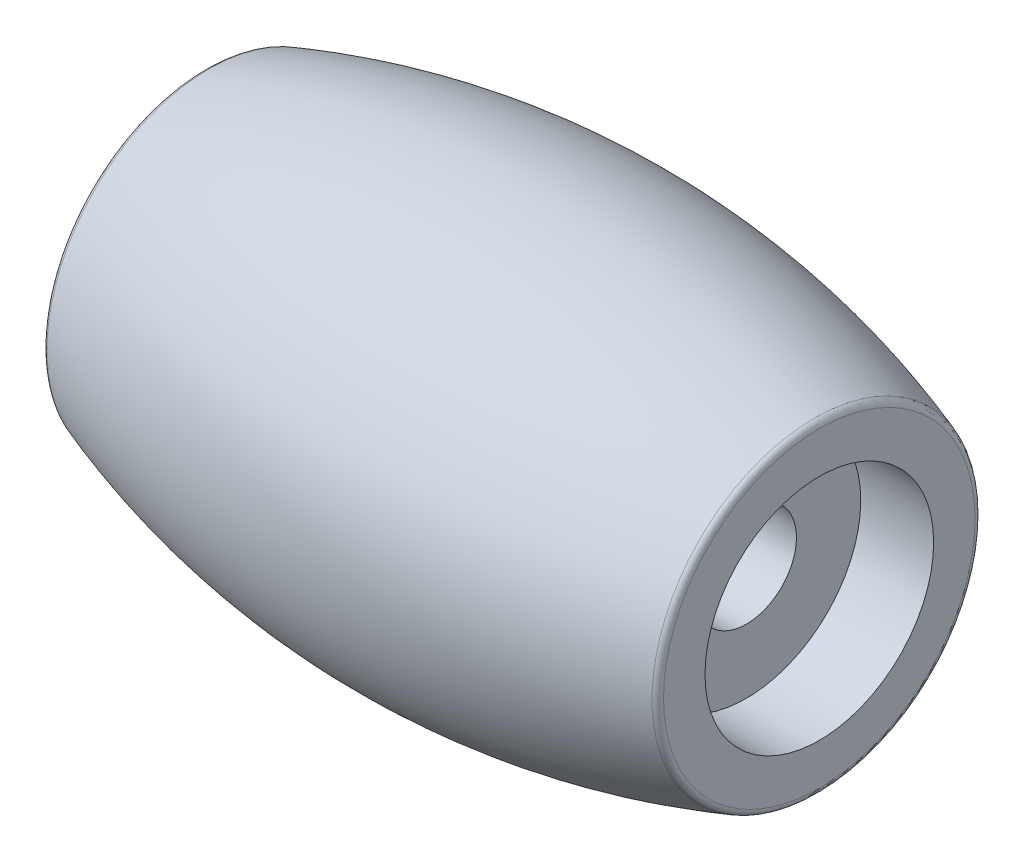
ISO-10303-21;
HEADER;
FILE_DESCRIPTION(('STEP AP214'),'2;1');
FILE_NAME('part.step','',(''),(''),'','','');
FILE_SCHEMA(('AUTOMOTIVE_DESIGN { 1 0 10303 214 1 1 1 1 }'));
ENDSEC;
DATA;
#1=APPLICATION_CONTEXT('core data for automotive mechanical design processes');
#2=APPLICATION_PROTOCOL_DEFINITION('international standard','automotive_design',2000,#1);
#3=PRODUCT_CONTEXT('',#1,'mechanical');
#4=PRODUCT('Part','Part','',(#3));
#5=PRODUCT_RELATED_PRODUCT_CATEGORY('part','',(#4));
#6=PRODUCT_DEFINITION_FORMATION('','',#4);
#7=PRODUCT_DEFINITION_CONTEXT('part definition',#1,'design');
#8=PRODUCT_DEFINITION('design','',#6,#7);
#9=PRODUCT_DEFINITION_SHAPE('','',#8);
#10=(LENGTH_UNIT() NAMED_UNIT(*) SI_UNIT(.MILLI.,.METRE.));
#11=(NAMED_UNIT(*) PLANE_ANGLE_UNIT() SI_UNIT($,.RADIAN.));
#12=(NAMED_UNIT(*) SI_UNIT($,.STERADIAN.) SOLID_ANGLE_UNIT());
#13=UNCERTAINTY_MEASURE_WITH_UNIT(LENGTH_MEASURE(1.E-05),#10,'distance_accuracy_value','');
#14=(GEOMETRIC_REPRESENTATION_CONTEXT(3) GLOBAL_UNCERTAINTY_ASSIGNED_CONTEXT((#13)) GLOBAL_UNIT_ASSIGNED_CONTEXT((#10,
#11,#12)) REPRESENTATION_CONTEXT('',''));
#15=CARTESIAN_POINT('',(0.,0.,0.));
#16=DIRECTION('',(0.,0.,1.));
#17=DIRECTION('',(1.,0.,0.));
#18=AXIS2_PLACEMENT_3D('',#15,#16,#17);
#19=CARTESIAN_POINT('',(-21.5,48.5,0.));
#20=DIRECTION('',(-1.,0.,0.));
#21=DIRECTION('',(0.,0.,1.));
#22=AXIS2_PLACEMENT_3D('',#19,#20,#21);
#23=CYLINDRICAL_SURFACE('',#22,3.5);
#24=CARTESIAN_POINT('',(16.4,48.5,0.));
#25=DIRECTION('',(-1.,0.,0.));
#26=DIRECTION('',(0.,0.,1.));
#27=AXIS2_PLACEMENT_3D('',#24,#25,#26);
#28=CIRCLE('',#27,3.5);
#29=CARTESIAN_POINT('',(16.4,48.5,3.5));
#30=VERTEX_POINT('',#29);
#31=EDGE_CURVE('E255',#30,#30,#28,.F.);
#32=ORIENTED_EDGE('',*,*,#31,.T.);
#33=EDGE_LOOP('',(#32));
#34=FACE_BOUND('',#33,.T.);
#35=CARTESIAN_POINT('',(-16.4,48.5,0.));
#36=DIRECTION('',(-1.,0.,0.));
#37=DIRECTION('',(0.,0.,1.));
#38=AXIS2_PLACEMENT_3D('',#35,#36,#37);
#39=CIRCLE('',#38,3.5);
#40=CARTESIAN_POINT('',(-16.4,48.5,3.5));
#41=VERTEX_POINT('',#40);
#42=EDGE_CURVE('E258',#41,#41,#39,.T.);
#43=ORIENTED_EDGE('',*,*,#42,.T.);
#44=EDGE_LOOP('',(#43));
#45=FACE_BOUND('',#44,.T.);
#46=ADVANCED_FACE('F16',(#34,#45),#23,.F.);
#47=CARTESIAN_POINT('',(16.4,56.5,0.));
#48=DIRECTION('',(-1.,0.,0.));
#49=DIRECTION('',(0.,0.,1.));
#50=AXIS2_PLACEMENT_3D('',#47,#48,#49);
#51=PLANE('',#50);
#52=ORIENTED_EDGE('',*,*,#31,.F.);
#53=EDGE_LOOP('',(#52));
#54=FACE_BOUND('',#53,.T.);
#55=CARTESIAN_POINT('',(16.4,48.5,0.));
#56=DIRECTION('',(-1.,0.,0.));
#57=DIRECTION('',(0.,0.,1.));
#58=AXIS2_PLACEMENT_3D('',#55,#56,#57);
#59=CIRCLE('',#58,8.);
#60=CARTESIAN_POINT('',(16.4,48.5,8.));
#61=VERTEX_POINT('',#60);
#62=EDGE_CURVE('E259',#61,#61,#59,.F.);
#63=ORIENTED_EDGE('',*,*,#62,.T.);
#64=EDGE_LOOP('',(#63));
#65=FACE_BOUND('',#64,.T.);
#66=ADVANCED_FACE('F223',(#54,#65),#51,.F.);
#67=CARTESIAN_POINT('',(-16.4,56.5,0.));
#68=DIRECTION('',(1.,0.,0.));
#69=DIRECTION('',(0.,0.,-1.));
#70=AXIS2_PLACEMENT_3D('',#67,#68,#69);
#71=PLANE('',#70);
#72=ORIENTED_EDGE('',*,*,#42,.F.);
#73=EDGE_LOOP('',(#72));
#74=FACE_BOUND('',#73,.T.);
#75=CARTESIAN_POINT('',(-16.4,48.5,0.));
#76=DIRECTION('',(-1.,0.,0.));
#77=DIRECTION('',(0.,0.,1.));
#78=AXIS2_PLACEMENT_3D('',#75,#76,#77);
#79=CIRCLE('',#78,8.);
#80=CARTESIAN_POINT('',(-16.4,48.5,8.));
#81=VERTEX_POINT('',#80);
#82=EDGE_CURVE('E262',#81,#81,#79,.T.);
#83=ORIENTED_EDGE('',*,*,#82,.T.);
#84=EDGE_LOOP('',(#83));
#85=FACE_BOUND('',#84,.T.);
#86=ADVANCED_FACE('F214',(#74,#85),#71,.F.);
#87=CARTESIAN_POINT('',(-21.5,48.5,0.));
#88=DIRECTION('',(-1.,0.,0.));
#89=DIRECTION('',(0.,0.,1.));
#90=AXIS2_PLACEMENT_3D('',#87,#88,#89);
#91=CYLINDRICAL_SURFACE('',#90,8.);
#92=CARTESIAN_POINT('',(21.5,48.5,0.));
#93=DIRECTION('',(-1.,0.,0.));
#94=DIRECTION('',(0.,0.,1.));
#95=AXIS2_PLACEMENT_3D('',#92,#93,#94);
#96=CIRCLE('',#95,8.);
#97=CARTESIAN_POINT('',(21.5,48.5,8.));
#98=VERTEX_POINT('',#97);
#99=EDGE_CURVE('E52',#98,#98,#96,.F.);
#100=ORIENTED_EDGE('',*,*,#99,.T.);
#101=EDGE_LOOP('',(#100));
#102=FACE_BOUND('',#101,.T.);
#103=ORIENTED_EDGE('',*,*,#62,.F.);
#104=EDGE_LOOP('',(#103));
#105=FACE_BOUND('',#104,.T.);
#106=ADVANCED_FACE('F205',(#102,#105),#91,.F.);
#107=CARTESIAN_POINT('',(-21.5,48.5,0.));
#108=DIRECTION('',(-1.,0.,0.));
#109=DIRECTION('',(0.,0.,1.));
#110=AXIS2_PLACEMENT_3D('',#107,#108,#109);
#111=CYLINDRICAL_SURFACE('',#110,8.);
#112=ORIENTED_EDGE('',*,*,#82,.F.);
#113=EDGE_LOOP('',(#112));
#114=FACE_BOUND('',#113,.T.);
#115=CARTESIAN_POINT('',(-21.5,48.5,0.));
#116=DIRECTION('',(-1.,0.,0.));
#117=DIRECTION('',(0.,0.,1.));
#118=AXIS2_PLACEMENT_3D('',#115,#116,#117);
#119=CIRCLE('',#118,8.);
#120=CARTESIAN_POINT('',(-21.5,48.5,8.));
#121=VERTEX_POINT('',#120);
#122=EDGE_CURVE('E59',#121,#121,#119,.T.);
#123=ORIENTED_EDGE('',*,*,#122,.T.);
#124=EDGE_LOOP('',(#123));
#125=FACE_BOUND('',#124,.T.);
#126=ADVANCED_FACE('F197',(#114,#125),#111,.F.);
#127=CARTESIAN_POINT('',(21.5,59.7494769851586,0.));
#128=DIRECTION('',(-1.,0.,0.));
#129=DIRECTION('',(0.,0.,1.));
#130=AXIS2_PLACEMENT_3D('',#127,#128,#129);
#131=PLANE('',#130);
#132=ORIENTED_EDGE('',*,*,#99,.F.);
#133=EDGE_LOOP('',(#132));
#134=FACE_BOUND('',#133,.T.);
#135=CARTESIAN_POINT('',(21.5,48.5,0.));
#136=DIRECTION('',(-1.,0.,0.));
#137=DIRECTION('',(0.,0.,1.));
#138=AXIS2_PLACEMENT_3D('',#135,#136,#137);
#139=CIRCLE('',#138,10.89696961967);
#140=CARTESIAN_POINT('',(21.5,48.5,10.89696961967));
#141=VERTEX_POINT('',#140);
#142=CARTESIAN_POINT('',(21.5,48.5,-10.89696961967));
#143=VERTEX_POINT('',#142);
#144=EDGE_CURVE('E44',#141,#143,#139,.T.);
#145=ORIENTED_EDGE('',*,*,#144,.F.);
#146=CARTESIAN_POINT('',(21.5,48.5,0.));
#147=DIRECTION('',(-1.,0.,0.));
#148=DIRECTION('',(0.,0.,-1.));
#149=AXIS2_PLACEMENT_3D('',#146,#147,#148);
#150=CIRCLE('',#149,10.89696961967);
#151=EDGE_CURVE('E50',#143,#141,#150,.T.);
#152=ORIENTED_EDGE('',*,*,#151,.F.);
#153=EDGE_LOOP('',(#145,#152));
#154=FACE_BOUND('',#153,.T.);
#155=ADVANCED_FACE('F49',(#134,#154),#131,.F.);
#156=CARTESIAN_POINT('',(-21.5,59.7494769851586,0.));
#157=DIRECTION('',(1.,0.,0.));
#158=DIRECTION('',(0.,0.,-1.));
#159=AXIS2_PLACEMENT_3D('',#156,#157,#158);
#160=PLANE('',#159);
#161=ORIENTED_EDGE('',*,*,#122,.F.);
#162=EDGE_LOOP('',(#161));
#163=FACE_BOUND('',#162,.T.);
#164=CARTESIAN_POINT('',(-21.5,48.5,0.));
#165=DIRECTION('',(1.,0.,0.));
#166=DIRECTION('',(0.,0.,-1.));
#167=AXIS2_PLACEMENT_3D('',#164,#165,#166);
#168=CIRCLE('',#167,10.89696961967);
#169=CARTESIAN_POINT('',(-21.5,48.5,-10.89696961967));
#170=VERTEX_POINT('',#169);
#171=CARTESIAN_POINT('',(-21.5,48.5,10.89696961967));
#172=VERTEX_POINT('',#171);
#173=EDGE_CURVE('E35',#170,#172,#168,.T.);
#174=ORIENTED_EDGE('',*,*,#173,.F.);
#175=CARTESIAN_POINT('',(-21.5,48.5,0.));
#176=DIRECTION('',(1.,0.,0.));
#177=DIRECTION('',(0.,0.,1.));
#178=AXIS2_PLACEMENT_3D('',#175,#176,#177);
#179=CIRCLE('',#178,10.89696961967);
#180=EDGE_CURVE('E58',#172,#170,#179,.T.);
#181=ORIENTED_EDGE('',*,*,#180,.F.);
#182=EDGE_LOOP('',(#174,#181));
#183=FACE_BOUND('',#182,.T.);
#184=ADVANCED_FACE('F79',(#163,#183),#160,.F.);
#185=CARTESIAN_POINT('',(21.,48.5,0.));
#186=DIRECTION('',(-1.,0.,0.));
#187=DIRECTION('',(0.,0.,1.));
#188=AXIS2_PLACEMENT_3D('',#185,#186,#187);
#189=TOROIDAL_SURFACE('',#188,10.89696961967,0.5);
#190=ORIENTED_EDGE('',*,*,#144,.T.);
#191=ORIENTED_EDGE('',*,*,#151,.T.);
#192=EDGE_LOOP('',(#190,#191));
#193=FACE_BOUND('',#192,.T.);
#194=CARTESIAN_POINT('',(21.1666666666666,48.5,0.));
#195=DIRECTION('',(-1.,0.,0.));
#196=DIRECTION('',(0.,0.,-1.));
#197=AXIS2_PLACEMENT_3D('',#194,#195,#196);
#198=CIRCLE('',#197,11.368374140461);
#199=CARTESIAN_POINT('',(21.1666666666666,48.5,-11.368374140461));
#200=VERTEX_POINT('',#199);
#201=EDGE_CURVE('E27',#200,#200,#198,.T.);
#202=ORIENTED_EDGE('',*,*,#201,.F.);
#203=EDGE_LOOP('',(#202));
#204=FACE_BOUND('',#203,.T.);
#205=ADVANCED_FACE('F56',(#193,#204),#189,.T.);
#206=CARTESIAN_POINT('',(-21.,48.5,0.));
#207=DIRECTION('',(1.,0.,0.));
#208=DIRECTION('',(0.,0.,-1.));
#209=AXIS2_PLACEMENT_3D('',#206,#207,#208);
#210=TOROIDAL_SURFACE('',#209,10.89696961967,0.5);
#211=CARTESIAN_POINT('',(-21.1666666666667,48.5,0.));
#212=DIRECTION('',(-1.,0.,0.));
#213=DIRECTION('',(0.,0.,-1.));
#214=AXIS2_PLACEMENT_3D('',#211,#212,#213);
#215=CIRCLE('',#214,11.368374140461);
#216=CARTESIAN_POINT('',(-21.1666666666667,48.5,-11.368374140461));
#217=VERTEX_POINT('',#216);
#218=EDGE_CURVE('E11',#217,#217,#215,.F.);
#219=ORIENTED_EDGE('',*,*,#218,.F.);
#220=EDGE_LOOP('',(#219));
#221=FACE_BOUND('',#220,.T.);
#222=ORIENTED_EDGE('',*,*,#180,.T.);
#223=ORIENTED_EDGE('',*,*,#173,.T.);
#224=EDGE_LOOP('',(#222,#223));
#225=FACE_BOUND('',#224,.T.);
#226=ADVANCED_FACE('F78',(#221,#225),#210,.T.);
#227=CARTESIAN_POINT('',(0.,48.5,48.5));
#228=DIRECTION('',(0.,-1.,0.));
#229=DIRECTION('',(0.,0.,-1.));
#230=AXIS2_PLACEMENT_3D('',#227,#228,#229);
#231=CIRCLE('',#230,63.5);
#232=TRIMMED_CURVE('',#231,(PARAMETER_VALUE(-0.701647923837267)),
(PARAMETER_VALUE(0.701647923837266)),.T.,.PARAMETER.);
#233=CARTESIAN_POINT('',(0.,48.5,0.));
#234=DIRECTION('',(-1.,0.,0.));
#235=AXIS1_PLACEMENT('',#233,#234);
#236=SURFACE_OF_REVOLUTION('',#232,#235);
#237=ORIENTED_EDGE('',*,*,#201,.T.);
#238=EDGE_LOOP('',(#237));
#239=FACE_BOUND('',#238,.T.);
#240=ORIENTED_EDGE('',*,*,#218,.T.);
#241=EDGE_LOOP('',(#240));
#242=FACE_BOUND('',#241,.T.);
#243=ADVANCED_FACE('F117',(#239,#242),#236,.F.);
#244=CLOSED_SHELL('',(#46,#66,#86,#106,#126,#155,#184,#205,#226,#243));
#245=MANIFOLD_SOLID_BREP('B1',#244);
#246=ADVANCED_BREP_SHAPE_REPRESENTATION('',(#18,#245),#14);
#247=SHAPE_DEFINITION_REPRESENTATION(#9,#246);
ENDSEC;
END-ISO-10303-21;
